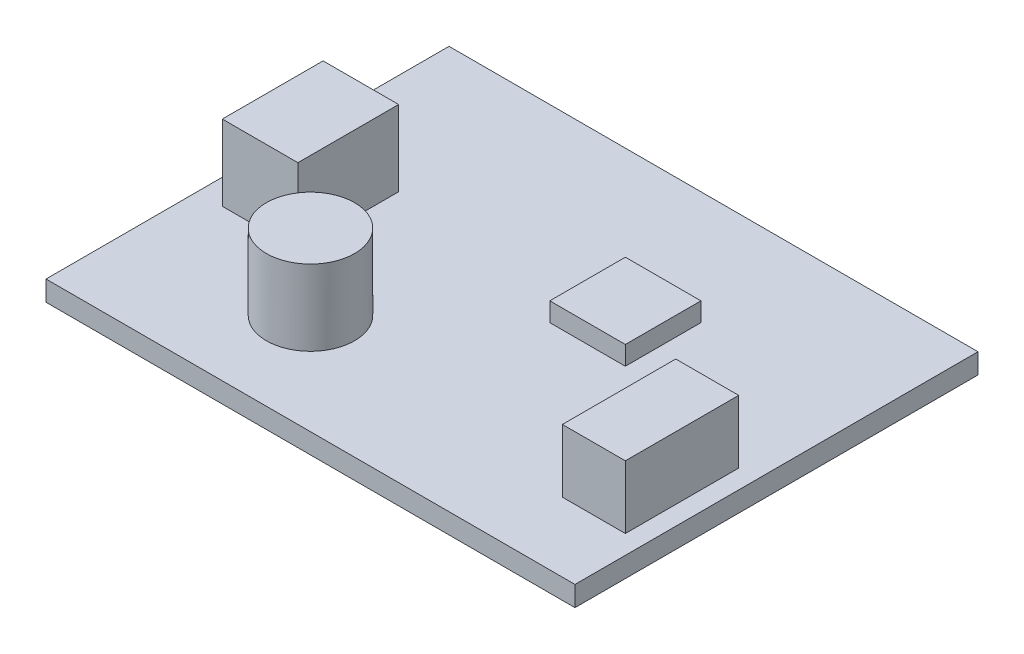
ISO-10303-21;
HEADER;
FILE_DESCRIPTION(('STEP AP214'),'2;1');
FILE_NAME('part.step','',(''),(''),'','','');
FILE_SCHEMA(('AUTOMOTIVE_DESIGN { 1 0 10303 214 1 1 1 1 }'));
ENDSEC;
DATA;
#1=APPLICATION_CONTEXT('core data for automotive mechanical design processes');
#2=APPLICATION_PROTOCOL_DEFINITION('international standard','automotive_design',2000,#1);
#3=PRODUCT_CONTEXT('',#1,'mechanical');
#4=PRODUCT('Part','Part','',(#3));
#5=PRODUCT_RELATED_PRODUCT_CATEGORY('part','',(#4));
#6=PRODUCT_DEFINITION_FORMATION('','',#4);
#7=PRODUCT_DEFINITION_CONTEXT('part definition',#1,'design');
#8=PRODUCT_DEFINITION('design','',#6,#7);
#9=PRODUCT_DEFINITION_SHAPE('','',#8);
#10=(LENGTH_UNIT() NAMED_UNIT(*) SI_UNIT(.MILLI.,.METRE.));
#11=(NAMED_UNIT(*) PLANE_ANGLE_UNIT() SI_UNIT($,.RADIAN.));
#12=(NAMED_UNIT(*) SI_UNIT($,.STERADIAN.) SOLID_ANGLE_UNIT());
#13=UNCERTAINTY_MEASURE_WITH_UNIT(LENGTH_MEASURE(1.E-05),#10,'distance_accuracy_value','');
#14=(GEOMETRIC_REPRESENTATION_CONTEXT(3) GLOBAL_UNCERTAINTY_ASSIGNED_CONTEXT((#13)) GLOBAL_UNIT_ASSIGNED_CONTEXT((#10,
#11,#12)) REPRESENTATION_CONTEXT('',''));
#15=CARTESIAN_POINT('',(0.,0.,0.));
#16=DIRECTION('',(0.,0.,1.));
#17=DIRECTION('',(1.,0.,0.));
#18=AXIS2_PLACEMENT_3D('',#15,#16,#17);
#19=CARTESIAN_POINT('',(0.,1.6,0.));
#20=DIRECTION('',(0.,-1.,0.));
#21=DIRECTION('',(0.,0.,-1.));
#22=AXIS2_PLACEMENT_3D('',#19,#20,#21);
#23=PLANE('',#22);
#24=CARTESIAN_POINT('',(-8.,1.6,8.));
#25=DIRECTION('',(0.,-1.,0.));
#26=DIRECTION('',(0.,0.,-1.));
#27=AXIS2_PLACEMENT_3D('',#24,#25,#26);
#28=CIRCLE('',#27,3.5);
#29=CARTESIAN_POINT('',(-8.,1.6,4.5));
#30=VERTEX_POINT('',#29);
#31=EDGE_CURVE('E11',#30,#30,#28,.F.);
#32=ORIENTED_EDGE('',*,*,#31,.F.);
#33=EDGE_LOOP('',(#32));
#34=FACE_BOUND('',#33,.T.);
#35=DIRECTION('',(0.,0.,-1.));
#36=VECTOR('',#35,1.);
#37=CARTESIAN_POINT('',(19.5,1.6,10.5));
#38=LINE('',#37,#36);
#39=CARTESIAN_POINT('',(19.5,1.6,10.5));
#40=VERTEX_POINT('',#39);
#41=CARTESIAN_POINT('',(19.5,1.6,1.5));
#42=VERTEX_POINT('',#41);
#43=EDGE_CURVE('E189',#40,#42,#38,.T.);
#44=ORIENTED_EDGE('',*,*,#43,.F.);
#45=DIRECTION('',(1.,0.,0.));
#46=VECTOR('',#45,1.);
#47=CARTESIAN_POINT('',(14.5,1.6,10.5));
#48=LINE('',#47,#46);
#49=CARTESIAN_POINT('',(14.5,1.6,10.5));
#50=VERTEX_POINT('',#49);
#51=EDGE_CURVE('E201',#50,#40,#48,.T.);
#52=ORIENTED_EDGE('',*,*,#51,.F.);
#53=DIRECTION('',(0.,0.,1.));
#54=VECTOR('',#53,1.);
#55=CARTESIAN_POINT('',(14.5,1.6,10.5));
#56=LINE('',#55,#54);
#57=CARTESIAN_POINT('',(14.5,1.6,1.5));
#58=VERTEX_POINT('',#57);
#59=EDGE_CURVE('E216',#58,#50,#56,.T.);
#60=ORIENTED_EDGE('',*,*,#59,.F.);
#61=DIRECTION('',(-1.,0.,0.));
#62=VECTOR('',#61,1.);
#63=CARTESIAN_POINT('',(14.5,1.6,1.5));
#64=LINE('',#63,#62);
#65=EDGE_CURVE('E194',#42,#58,#64,.T.);
#66=ORIENTED_EDGE('',*,*,#65,.F.);
#67=EDGE_LOOP('',(#44,#52,#60,#66));
#68=FACE_BOUND('',#67,.T.);
#69=DIRECTION('',(0.,0.,-1.));
#70=VECTOR('',#69,1.);
#71=CARTESIAN_POINT('',(21.,1.6,16.));
#72=LINE('',#71,#70);
#73=CARTESIAN_POINT('',(21.,1.6,16.));
#74=VERTEX_POINT('',#73);
#75=CARTESIAN_POINT('',(21.,1.6,-16.));
#76=VERTEX_POINT('',#75);
#77=EDGE_CURVE('E285',#74,#76,#72,.T.);
#78=ORIENTED_EDGE('',*,*,#77,.T.);
#79=DIRECTION('',(-1.,0.,0.));
#80=VECTOR('',#79,1.);
#81=CARTESIAN_POINT('',(-21.,1.6,-16.));
#82=LINE('',#81,#80);
#83=CARTESIAN_POINT('',(-21.,1.6,-16.));
#84=VERTEX_POINT('',#83);
#85=EDGE_CURVE('E290',#76,#84,#82,.T.);
#86=ORIENTED_EDGE('',*,*,#85,.T.);
#87=DIRECTION('',(0.,0.,1.));
#88=VECTOR('',#87,1.);
#89=CARTESIAN_POINT('',(-21.,1.6,16.));
#90=LINE('',#89,#88);
#91=CARTESIAN_POINT('',(-21.,1.6,16.));
#92=VERTEX_POINT('',#91);
#93=EDGE_CURVE('E295',#84,#92,#90,.T.);
#94=ORIENTED_EDGE('',*,*,#93,.T.);
#95=DIRECTION('',(1.,0.,0.));
#96=VECTOR('',#95,1.);
#97=CARTESIAN_POINT('',(-21.,1.6,16.));
#98=LINE('',#97,#96);
#99=EDGE_CURVE('E293',#92,#74,#98,.T.);
#100=ORIENTED_EDGE('',*,*,#99,.T.);
#101=EDGE_LOOP('',(#78,#86,#94,#100));
#102=FACE_BOUND('',#101,.T.);
#103=DIRECTION('',(0.,0.,-1.));
#104=VECTOR('',#103,1.);
#105=CARTESIAN_POINT('',(8.,1.6,-1.));
#106=LINE('',#105,#104);
#107=CARTESIAN_POINT('',(8.,1.6,-1.));
#108=VERTEX_POINT('',#107);
#109=CARTESIAN_POINT('',(8.,1.6,-7.));
#110=VERTEX_POINT('',#109);
#111=EDGE_CURVE('E236',#108,#110,#106,.T.);
#112=ORIENTED_EDGE('',*,*,#111,.F.);
#113=DIRECTION('',(1.,0.,0.));
#114=VECTOR('',#113,1.);
#115=CARTESIAN_POINT('',(2.,1.6,-1.));
#116=LINE('',#115,#114);
#117=CARTESIAN_POINT('',(2.,1.6,-1.));
#118=VERTEX_POINT('',#117);
#119=EDGE_CURVE('E245',#118,#108,#116,.T.);
#120=ORIENTED_EDGE('',*,*,#119,.F.);
#121=DIRECTION('',(0.,0.,1.));
#122=VECTOR('',#121,1.);
#123=CARTESIAN_POINT('',(2.,1.6,-1.));
#124=LINE('',#123,#122);
#125=CARTESIAN_POINT('',(2.,1.6,-7.));
#126=VERTEX_POINT('',#125);
#127=EDGE_CURVE('E261',#126,#118,#124,.T.);
#128=ORIENTED_EDGE('',*,*,#127,.F.);
#129=DIRECTION('',(-1.,0.,0.));
#130=VECTOR('',#129,1.);
#131=CARTESIAN_POINT('',(2.,1.6,-7.));
#132=LINE('',#131,#130);
#133=EDGE_CURVE('E260',#110,#126,#132,.T.);
#134=ORIENTED_EDGE('',*,*,#133,.F.);
#135=EDGE_LOOP('',(#112,#120,#128,#134));
#136=FACE_BOUND('',#135,.T.);
#137=DIRECTION('',(0.,0.,-1.));
#138=VECTOR('',#137,1.);
#139=CARTESIAN_POINT('',(-13.,1.6,4.));
#140=LINE('',#139,#138);
#141=CARTESIAN_POINT('',(-13.,1.6,4.));
#142=VERTEX_POINT('',#141);
#143=CARTESIAN_POINT('',(-13.,1.6,-4.));
#144=VERTEX_POINT('',#143);
#145=EDGE_CURVE('E183',#142,#144,#140,.T.);
#146=ORIENTED_EDGE('',*,*,#145,.F.);
#147=DIRECTION('',(1.,0.,0.));
#148=VECTOR('',#147,1.);
#149=CARTESIAN_POINT('',(-19.,1.6,4.));
#150=LINE('',#149,#148);
#151=CARTESIAN_POINT('',(-19.,1.6,4.));
#152=VERTEX_POINT('',#151);
#153=EDGE_CURVE('E185',#152,#142,#150,.T.);
#154=ORIENTED_EDGE('',*,*,#153,.F.);
#155=DIRECTION('',(0.,0.,1.));
#156=VECTOR('',#155,1.);
#157=CARTESIAN_POINT('',(-19.,1.6,4.));
#158=LINE('',#157,#156);
#159=CARTESIAN_POINT('',(-19.,1.6,-4.));
#160=VERTEX_POINT('',#159);
#161=EDGE_CURVE('E68',#160,#152,#158,.T.);
#162=ORIENTED_EDGE('',*,*,#161,.F.);
#163=DIRECTION('',(-1.,0.,0.));
#164=VECTOR('',#163,1.);
#165=CARTESIAN_POINT('',(-19.,1.6,-4.));
#166=LINE('',#165,#164);
#167=EDGE_CURVE('E61',#144,#160,#166,.T.);
#168=ORIENTED_EDGE('',*,*,#167,.F.);
#169=EDGE_LOOP('',(#146,#154,#162,#168));
#170=FACE_BOUND('',#169,.T.);
#171=ADVANCED_FACE('F47',(#34,#68,#102,#136,#170),#23,.F.);
#172=CARTESIAN_POINT('',(21.,1.6,16.));
#173=DIRECTION('',(-1.,0.,0.));
#174=DIRECTION('',(0.,0.,1.));
#175=AXIS2_PLACEMENT_3D('',#172,#173,#174);
#176=PLANE('',#175);
#177=DIRECTION('',(0.,0.,-1.));
#178=VECTOR('',#177,1.);
#179=CARTESIAN_POINT('',(21.,0.,16.));
#180=LINE('',#179,#178);
#181=CARTESIAN_POINT('',(21.,0.,16.));
#182=VERTEX_POINT('',#181);
#183=CARTESIAN_POINT('',(21.,0.,-16.));
#184=VERTEX_POINT('',#183);
#185=EDGE_CURVE('E282',#182,#184,#180,.T.);
#186=ORIENTED_EDGE('',*,*,#185,.T.);
#187=DIRECTION('',(0.,-1.,0.));
#188=VECTOR('',#187,1.);
#189=CARTESIAN_POINT('',(21.,1.6,-16.));
#190=LINE('',#189,#188);
#191=EDGE_CURVE('E59',#76,#184,#190,.T.);
#192=ORIENTED_EDGE('',*,*,#191,.F.);
#193=ORIENTED_EDGE('',*,*,#77,.F.);
#194=DIRECTION('',(0.,-1.,0.));
#195=VECTOR('',#194,1.);
#196=CARTESIAN_POINT('',(21.,1.6,16.));
#197=LINE('',#196,#195);
#198=EDGE_CURVE('E297',#74,#182,#197,.T.);
#199=ORIENTED_EDGE('',*,*,#198,.T.);
#200=EDGE_LOOP('',(#186,#192,#193,#199));
#201=FACE_BOUND('',#200,.T.);
#202=ADVANCED_FACE('F51',(#201),#176,.F.);
#203=CARTESIAN_POINT('',(-21.,1.6,-16.));
#204=DIRECTION('',(0.,0.,1.));
#205=DIRECTION('',(1.,0.,0.));
#206=AXIS2_PLACEMENT_3D('',#203,#204,#205);
#207=PLANE('',#206);
#208=DIRECTION('',(-1.,0.,0.));
#209=VECTOR('',#208,1.);
#210=CARTESIAN_POINT('',(-21.,0.,-16.));
#211=LINE('',#210,#209);
#212=CARTESIAN_POINT('',(-21.,0.,-16.));
#213=VERTEX_POINT('',#212);
#214=EDGE_CURVE('E304',#184,#213,#211,.T.);
#215=ORIENTED_EDGE('',*,*,#214,.T.);
#216=DIRECTION('',(0.,-1.,0.));
#217=VECTOR('',#216,1.);
#218=CARTESIAN_POINT('',(-21.,1.6,-16.));
#219=LINE('',#218,#217);
#220=EDGE_CURVE('E320',#84,#213,#219,.T.);
#221=ORIENTED_EDGE('',*,*,#220,.F.);
#222=ORIENTED_EDGE('',*,*,#85,.F.);
#223=ORIENTED_EDGE('',*,*,#191,.T.);
#224=EDGE_LOOP('',(#215,#221,#222,#223));
#225=FACE_BOUND('',#224,.T.);
#226=ADVANCED_FACE('F322',(#225),#207,.F.);
#227=CARTESIAN_POINT('',(-21.,1.6,16.));
#228=DIRECTION('',(1.,0.,0.));
#229=DIRECTION('',(0.,0.,-1.));
#230=AXIS2_PLACEMENT_3D('',#227,#228,#229);
#231=PLANE('',#230);
#232=DIRECTION('',(0.,0.,1.));
#233=VECTOR('',#232,1.);
#234=CARTESIAN_POINT('',(-21.,0.,16.));
#235=LINE('',#234,#233);
#236=CARTESIAN_POINT('',(-21.,0.,16.));
#237=VERTEX_POINT('',#236);
#238=EDGE_CURVE('E303',#213,#237,#235,.T.);
#239=ORIENTED_EDGE('',*,*,#238,.T.);
#240=DIRECTION('',(0.,-1.,0.));
#241=VECTOR('',#240,1.);
#242=CARTESIAN_POINT('',(-21.,1.6,16.));
#243=LINE('',#242,#241);
#244=EDGE_CURVE('E311',#92,#237,#243,.T.);
#245=ORIENTED_EDGE('',*,*,#244,.F.);
#246=ORIENTED_EDGE('',*,*,#93,.F.);
#247=ORIENTED_EDGE('',*,*,#220,.T.);
#248=EDGE_LOOP('',(#239,#245,#246,#247));
#249=FACE_BOUND('',#248,.T.);
#250=ADVANCED_FACE('F338',(#249),#231,.F.);
#251=CARTESIAN_POINT('',(-21.,1.6,16.));
#252=DIRECTION('',(0.,0.,-1.));
#253=DIRECTION('',(-1.,0.,0.));
#254=AXIS2_PLACEMENT_3D('',#251,#252,#253);
#255=PLANE('',#254);
#256=DIRECTION('',(1.,0.,0.));
#257=VECTOR('',#256,1.);
#258=CARTESIAN_POINT('',(-21.,0.,16.));
#259=LINE('',#258,#257);
#260=EDGE_CURVE('E286',#237,#182,#259,.T.);
#261=ORIENTED_EDGE('',*,*,#260,.T.);
#262=ORIENTED_EDGE('',*,*,#198,.F.);
#263=ORIENTED_EDGE('',*,*,#99,.F.);
#264=ORIENTED_EDGE('',*,*,#244,.T.);
#265=EDGE_LOOP('',(#261,#262,#263,#264));
#266=FACE_BOUND('',#265,.T.);
#267=ADVANCED_FACE('F336',(#266),#255,.F.);
#268=CARTESIAN_POINT('',(0.,0.,0.));
#269=DIRECTION('',(0.,-1.,0.));
#270=DIRECTION('',(0.,0.,-1.));
#271=AXIS2_PLACEMENT_3D('',#268,#269,#270);
#272=PLANE('',#271);
#273=ORIENTED_EDGE('',*,*,#185,.F.);
#274=ORIENTED_EDGE('',*,*,#260,.F.);
#275=ORIENTED_EDGE('',*,*,#238,.F.);
#276=ORIENTED_EDGE('',*,*,#214,.F.);
#277=EDGE_LOOP('',(#273,#274,#275,#276));
#278=FACE_BOUND('',#277,.T.);
#279=ADVANCED_FACE('F335',(#278),#272,.T.);
#280=CARTESIAN_POINT('',(8.,3.1,-1.));
#281=DIRECTION('',(-1.,0.,0.));
#282=DIRECTION('',(0.,0.,1.));
#283=AXIS2_PLACEMENT_3D('',#280,#281,#282);
#284=PLANE('',#283);
#285=ORIENTED_EDGE('',*,*,#111,.T.);
#286=DIRECTION('',(0.,-1.,0.));
#287=VECTOR('',#286,1.);
#288=CARTESIAN_POINT('',(8.,3.1,-7.));
#289=LINE('',#288,#287);
#290=CARTESIAN_POINT('',(8.,3.1,-7.));
#291=VERTEX_POINT('',#290);
#292=EDGE_CURVE('E276',#291,#110,#289,.T.);
#293=ORIENTED_EDGE('',*,*,#292,.F.);
#294=DIRECTION('',(0.,0.,-1.));
#295=VECTOR('',#294,1.);
#296=CARTESIAN_POINT('',(8.,3.1,-1.));
#297=LINE('',#296,#295);
#298=CARTESIAN_POINT('',(8.,3.1,-1.));
#299=VERTEX_POINT('',#298);
#300=EDGE_CURVE('E239',#299,#291,#297,.T.);
#301=ORIENTED_EDGE('',*,*,#300,.F.);
#302=DIRECTION('',(0.,-1.,0.));
#303=VECTOR('',#302,1.);
#304=CARTESIAN_POINT('',(8.,3.1,-1.));
#305=LINE('',#304,#303);
#306=EDGE_CURVE('E251',#299,#108,#305,.T.);
#307=ORIENTED_EDGE('',*,*,#306,.T.);
#308=EDGE_LOOP('',(#285,#293,#301,#307));
#309=FACE_BOUND('',#308,.T.);
#310=ADVANCED_FACE('F421',(#309),#284,.F.);
#311=CARTESIAN_POINT('',(2.,3.1,-7.));
#312=DIRECTION('',(0.,0.,1.));
#313=DIRECTION('',(1.,0.,0.));
#314=AXIS2_PLACEMENT_3D('',#311,#312,#313);
#315=PLANE('',#314);
#316=ORIENTED_EDGE('',*,*,#133,.T.);
#317=DIRECTION('',(0.,-1.,0.));
#318=VECTOR('',#317,1.);
#319=CARTESIAN_POINT('',(2.,3.1,-7.));
#320=LINE('',#319,#318);
#321=CARTESIAN_POINT('',(2.,3.1,-7.));
#322=VERTEX_POINT('',#321);
#323=EDGE_CURVE('E274',#322,#126,#320,.T.);
#324=ORIENTED_EDGE('',*,*,#323,.F.);
#325=DIRECTION('',(-1.,0.,0.));
#326=VECTOR('',#325,1.);
#327=CARTESIAN_POINT('',(2.,3.1,-7.));
#328=LINE('',#327,#326);
#329=EDGE_CURVE('E242',#291,#322,#328,.T.);
#330=ORIENTED_EDGE('',*,*,#329,.F.);
#331=ORIENTED_EDGE('',*,*,#292,.T.);
#332=EDGE_LOOP('',(#316,#324,#330,#331));
#333=FACE_BOUND('',#332,.T.);
#334=ADVANCED_FACE('F420',(#333),#315,.F.);
#335=CARTESIAN_POINT('',(2.,3.1,-1.));
#336=DIRECTION('',(1.,0.,0.));
#337=DIRECTION('',(0.,0.,-1.));
#338=AXIS2_PLACEMENT_3D('',#335,#336,#337);
#339=PLANE('',#338);
#340=ORIENTED_EDGE('',*,*,#127,.T.);
#341=DIRECTION('',(0.,-1.,0.));
#342=VECTOR('',#341,1.);
#343=CARTESIAN_POINT('',(2.,3.1,-1.));
#344=LINE('',#343,#342);
#345=CARTESIAN_POINT('',(2.,3.1,-1.));
#346=VERTEX_POINT('',#345);
#347=EDGE_CURVE('E271',#346,#118,#344,.T.);
#348=ORIENTED_EDGE('',*,*,#347,.F.);
#349=DIRECTION('',(0.,0.,1.));
#350=VECTOR('',#349,1.);
#351=CARTESIAN_POINT('',(2.,3.1,-1.));
#352=LINE('',#351,#350);
#353=EDGE_CURVE('E249',#322,#346,#352,.T.);
#354=ORIENTED_EDGE('',*,*,#353,.F.);
#355=ORIENTED_EDGE('',*,*,#323,.T.);
#356=EDGE_LOOP('',(#340,#348,#354,#355));
#357=FACE_BOUND('',#356,.T.);
#358=ADVANCED_FACE('F413',(#357),#339,.F.);
#359=CARTESIAN_POINT('',(2.,3.1,-1.));
#360=DIRECTION('',(0.,0.,-1.));
#361=DIRECTION('',(-1.,0.,0.));
#362=AXIS2_PLACEMENT_3D('',#359,#360,#361);
#363=PLANE('',#362);
#364=ORIENTED_EDGE('',*,*,#119,.T.);
#365=ORIENTED_EDGE('',*,*,#306,.F.);
#366=DIRECTION('',(1.,0.,0.));
#367=VECTOR('',#366,1.);
#368=CARTESIAN_POINT('',(2.,3.1,-1.));
#369=LINE('',#368,#367);
#370=EDGE_CURVE('E248',#346,#299,#369,.T.);
#371=ORIENTED_EDGE('',*,*,#370,.F.);
#372=ORIENTED_EDGE('',*,*,#347,.T.);
#373=EDGE_LOOP('',(#364,#365,#371,#372));
#374=FACE_BOUND('',#373,.T.);
#375=ADVANCED_FACE('F412',(#374),#363,.F.);
#376=CARTESIAN_POINT('',(0.,3.1,0.));
#377=DIRECTION('',(0.,-1.,0.));
#378=DIRECTION('',(0.,0.,-1.));
#379=AXIS2_PLACEMENT_3D('',#376,#377,#378);
#380=PLANE('',#379);
#381=ORIENTED_EDGE('',*,*,#300,.T.);
#382=ORIENTED_EDGE('',*,*,#329,.T.);
#383=ORIENTED_EDGE('',*,*,#353,.T.);
#384=ORIENTED_EDGE('',*,*,#370,.T.);
#385=EDGE_LOOP('',(#381,#382,#383,#384));
#386=FACE_BOUND('',#385,.T.);
#387=ADVANCED_FACE('F403',(#386),#380,.F.);
#388=CARTESIAN_POINT('',(19.5,6.6,10.5));
#389=DIRECTION('',(-1.,0.,0.));
#390=DIRECTION('',(0.,0.,1.));
#391=AXIS2_PLACEMENT_3D('',#388,#389,#390);
#392=PLANE('',#391);
#393=ORIENTED_EDGE('',*,*,#43,.T.);
#394=DIRECTION('',(0.,-1.,0.));
#395=VECTOR('',#394,1.);
#396=CARTESIAN_POINT('',(19.5,6.6,1.5));
#397=LINE('',#396,#395);
#398=CARTESIAN_POINT('',(19.5,6.6,1.5));
#399=VERTEX_POINT('',#398);
#400=EDGE_CURVE('E231',#399,#42,#397,.T.);
#401=ORIENTED_EDGE('',*,*,#400,.F.);
#402=DIRECTION('',(0.,0.,-1.));
#403=VECTOR('',#402,1.);
#404=CARTESIAN_POINT('',(19.5,6.6,10.5));
#405=LINE('',#404,#403);
#406=CARTESIAN_POINT('',(19.5,6.6,10.5));
#407=VERTEX_POINT('',#406);
#408=EDGE_CURVE('E196',#407,#399,#405,.T.);
#409=ORIENTED_EDGE('',*,*,#408,.F.);
#410=DIRECTION('',(0.,-1.,0.));
#411=VECTOR('',#410,1.);
#412=CARTESIAN_POINT('',(19.5,6.6,10.5));
#413=LINE('',#412,#411);
#414=EDGE_CURVE('E211',#407,#40,#413,.T.);
#415=ORIENTED_EDGE('',*,*,#414,.T.);
#416=EDGE_LOOP('',(#393,#401,#409,#415));
#417=FACE_BOUND('',#416,.T.);
#418=ADVANCED_FACE('F386',(#417),#392,.F.);
#419=CARTESIAN_POINT('',(14.5,6.6,1.5));
#420=DIRECTION('',(0.,0.,1.));
#421=DIRECTION('',(1.,0.,0.));
#422=AXIS2_PLACEMENT_3D('',#419,#420,#421);
#423=PLANE('',#422);
#424=ORIENTED_EDGE('',*,*,#65,.T.);
#425=DIRECTION('',(0.,-1.,0.));
#426=VECTOR('',#425,1.);
#427=CARTESIAN_POINT('',(14.5,6.6,1.5));
#428=LINE('',#427,#426);
#429=CARTESIAN_POINT('',(14.5,6.6,1.5));
#430=VERTEX_POINT('',#429);
#431=EDGE_CURVE('E226',#430,#58,#428,.T.);
#432=ORIENTED_EDGE('',*,*,#431,.F.);
#433=DIRECTION('',(-1.,0.,0.));
#434=VECTOR('',#433,1.);
#435=CARTESIAN_POINT('',(14.5,6.6,1.5));
#436=LINE('',#435,#434);
#437=EDGE_CURVE('E205',#399,#430,#436,.T.);
#438=ORIENTED_EDGE('',*,*,#437,.F.);
#439=ORIENTED_EDGE('',*,*,#400,.T.);
#440=EDGE_LOOP('',(#424,#432,#438,#439));
#441=FACE_BOUND('',#440,.T.);
#442=ADVANCED_FACE('F399',(#441),#423,.F.);
#443=CARTESIAN_POINT('',(14.5,6.6,10.5));
#444=DIRECTION('',(1.,0.,0.));
#445=DIRECTION('',(0.,0.,-1.));
#446=AXIS2_PLACEMENT_3D('',#443,#444,#445);
#447=PLANE('',#446);
#448=ORIENTED_EDGE('',*,*,#59,.T.);
#449=DIRECTION('',(0.,-1.,0.));
#450=VECTOR('',#449,1.);
#451=CARTESIAN_POINT('',(14.5,6.6,10.5));
#452=LINE('',#451,#450);
#453=CARTESIAN_POINT('',(14.5,6.6,10.5));
#454=VERTEX_POINT('',#453);
#455=EDGE_CURVE('E228',#454,#50,#452,.T.);
#456=ORIENTED_EDGE('',*,*,#455,.F.);
#457=DIRECTION('',(0.,0.,1.));
#458=VECTOR('',#457,1.);
#459=CARTESIAN_POINT('',(14.5,6.6,10.5));
#460=LINE('',#459,#458);
#461=EDGE_CURVE('E206',#430,#454,#460,.T.);
#462=ORIENTED_EDGE('',*,*,#461,.F.);
#463=ORIENTED_EDGE('',*,*,#431,.T.);
#464=EDGE_LOOP('',(#448,#456,#462,#463));
#465=FACE_BOUND('',#464,.T.);
#466=ADVANCED_FACE('F391',(#465),#447,.F.);
#467=CARTESIAN_POINT('',(14.5,6.6,10.5));
#468=DIRECTION('',(0.,0.,-1.));
#469=DIRECTION('',(-1.,0.,0.));
#470=AXIS2_PLACEMENT_3D('',#467,#468,#469);
#471=PLANE('',#470);
#472=ORIENTED_EDGE('',*,*,#51,.T.);
#473=ORIENTED_EDGE('',*,*,#414,.F.);
#474=DIRECTION('',(1.,0.,0.));
#475=VECTOR('',#474,1.);
#476=CARTESIAN_POINT('',(14.5,6.6,10.5));
#477=LINE('',#476,#475);
#478=EDGE_CURVE('E207',#454,#407,#477,.T.);
#479=ORIENTED_EDGE('',*,*,#478,.F.);
#480=ORIENTED_EDGE('',*,*,#455,.T.);
#481=EDGE_LOOP('',(#472,#473,#479,#480));
#482=FACE_BOUND('',#481,.T.);
#483=ADVANCED_FACE('F384',(#482),#471,.F.);
#484=CARTESIAN_POINT('',(0.,6.6,0.));
#485=DIRECTION('',(0.,-1.,0.));
#486=DIRECTION('',(0.,0.,-1.));
#487=AXIS2_PLACEMENT_3D('',#484,#485,#486);
#488=PLANE('',#487);
#489=ORIENTED_EDGE('',*,*,#408,.T.);
#490=ORIENTED_EDGE('',*,*,#437,.T.);
#491=ORIENTED_EDGE('',*,*,#461,.T.);
#492=ORIENTED_EDGE('',*,*,#478,.T.);
#493=EDGE_LOOP('',(#489,#490,#491,#492));
#494=FACE_BOUND('',#493,.T.);
#495=ADVANCED_FACE('F393',(#494),#488,.F.);
#496=CARTESIAN_POINT('',(-13.,7.6,4.));
#497=DIRECTION('',(-1.,0.,0.));
#498=DIRECTION('',(0.,0.,1.));
#499=AXIS2_PLACEMENT_3D('',#496,#497,#498);
#500=PLANE('',#499);
#501=ORIENTED_EDGE('',*,*,#145,.T.);
#502=DIRECTION('',(0.,-1.,0.));
#503=VECTOR('',#502,1.);
#504=CARTESIAN_POINT('',(-13.,7.6,-4.));
#505=LINE('',#504,#503);
#506=CARTESIAN_POINT('',(-13.,7.6,-4.));
#507=VERTEX_POINT('',#506);
#508=EDGE_CURVE('E163',#507,#144,#505,.T.);
#509=ORIENTED_EDGE('',*,*,#508,.F.);
#510=DIRECTION('',(0.,0.,-1.));
#511=VECTOR('',#510,1.);
#512=CARTESIAN_POINT('',(-13.,7.6,4.));
#513=LINE('',#512,#511);
#514=CARTESIAN_POINT('',(-13.,7.6,4.));
#515=VERTEX_POINT('',#514);
#516=EDGE_CURVE('E174',#515,#507,#513,.T.);
#517=ORIENTED_EDGE('',*,*,#516,.F.);
#518=DIRECTION('',(0.,-1.,0.));
#519=VECTOR('',#518,1.);
#520=CARTESIAN_POINT('',(-13.,7.6,4.));
#521=LINE('',#520,#519);
#522=EDGE_CURVE('E352',#515,#142,#521,.T.);
#523=ORIENTED_EDGE('',*,*,#522,.T.);
#524=EDGE_LOOP('',(#501,#509,#517,#523));
#525=FACE_BOUND('',#524,.T.);
#526=ADVANCED_FACE('F184',(#525),#500,.F.);
#527=CARTESIAN_POINT('',(-19.,7.6,-4.));
#528=DIRECTION('',(0.,0.,1.));
#529=DIRECTION('',(1.,0.,0.));
#530=AXIS2_PLACEMENT_3D('',#527,#528,#529);
#531=PLANE('',#530);
#532=ORIENTED_EDGE('',*,*,#167,.T.);
#533=DIRECTION('',(0.,-1.,0.));
#534=VECTOR('',#533,1.);
#535=CARTESIAN_POINT('',(-19.,7.6,-4.));
#536=LINE('',#535,#534);
#537=CARTESIAN_POINT('',(-19.,7.6,-4.));
#538=VERTEX_POINT('',#537);
#539=EDGE_CURVE('E170',#538,#160,#536,.T.);
#540=ORIENTED_EDGE('',*,*,#539,.F.);
#541=DIRECTION('',(-1.,0.,0.));
#542=VECTOR('',#541,1.);
#543=CARTESIAN_POINT('',(-19.,7.6,-4.));
#544=LINE('',#543,#542);
#545=EDGE_CURVE('E159',#507,#538,#544,.T.);
#546=ORIENTED_EDGE('',*,*,#545,.F.);
#547=ORIENTED_EDGE('',*,*,#508,.T.);
#548=EDGE_LOOP('',(#532,#540,#546,#547));
#549=FACE_BOUND('',#548,.T.);
#550=ADVANCED_FACE('F165',(#549),#531,.F.);
#551=CARTESIAN_POINT('',(-19.,7.6,4.));
#552=DIRECTION('',(1.,0.,0.));
#553=DIRECTION('',(0.,0.,-1.));
#554=AXIS2_PLACEMENT_3D('',#551,#552,#553);
#555=PLANE('',#554);
#556=ORIENTED_EDGE('',*,*,#161,.T.);
#557=DIRECTION('',(0.,-1.,0.));
#558=VECTOR('',#557,1.);
#559=CARTESIAN_POINT('',(-19.,7.6,4.));
#560=LINE('',#559,#558);
#561=CARTESIAN_POINT('',(-19.,7.6,4.));
#562=VERTEX_POINT('',#561);
#563=EDGE_CURVE('E191',#562,#152,#560,.T.);
#564=ORIENTED_EDGE('',*,*,#563,.F.);
#565=DIRECTION('',(0.,0.,1.));
#566=VECTOR('',#565,1.);
#567=CARTESIAN_POINT('',(-19.,7.6,4.));
#568=LINE('',#567,#566);
#569=EDGE_CURVE('E173',#538,#562,#568,.T.);
#570=ORIENTED_EDGE('',*,*,#569,.F.);
#571=ORIENTED_EDGE('',*,*,#539,.T.);
#572=EDGE_LOOP('',(#556,#564,#570,#571));
#573=FACE_BOUND('',#572,.T.);
#574=ADVANCED_FACE('F569',(#573),#555,.F.);
#575=CARTESIAN_POINT('',(-19.,7.6,4.));
#576=DIRECTION('',(0.,0.,-1.));
#577=DIRECTION('',(-1.,0.,0.));
#578=AXIS2_PLACEMENT_3D('',#575,#576,#577);
#579=PLANE('',#578);
#580=ORIENTED_EDGE('',*,*,#153,.T.);
#581=ORIENTED_EDGE('',*,*,#522,.F.);
#582=DIRECTION('',(1.,0.,0.));
#583=VECTOR('',#582,1.);
#584=CARTESIAN_POINT('',(-19.,7.6,4.));
#585=LINE('',#584,#583);
#586=EDGE_CURVE('E179',#562,#515,#585,.T.);
#587=ORIENTED_EDGE('',*,*,#586,.F.);
#588=ORIENTED_EDGE('',*,*,#563,.T.);
#589=EDGE_LOOP('',(#580,#581,#587,#588));
#590=FACE_BOUND('',#589,.T.);
#591=ADVANCED_FACE('F354',(#590),#579,.F.);
#592=CARTESIAN_POINT('',(0.,7.6,0.));
#593=DIRECTION('',(0.,-1.,0.));
#594=DIRECTION('',(0.,0.,-1.));
#595=AXIS2_PLACEMENT_3D('',#592,#593,#594);
#596=PLANE('',#595);
#597=ORIENTED_EDGE('',*,*,#516,.T.);
#598=ORIENTED_EDGE('',*,*,#545,.T.);
#599=ORIENTED_EDGE('',*,*,#569,.T.);
#600=ORIENTED_EDGE('',*,*,#586,.T.);
#601=EDGE_LOOP('',(#597,#598,#599,#600));
#602=FACE_BOUND('',#601,.T.);
#603=ADVANCED_FACE('F171',(#602),#596,.F.);
#604=CARTESIAN_POINT('',(-8.,7.6,8.));
#605=DIRECTION('',(0.,-1.,0.));
#606=DIRECTION('',(0.,0.,-1.));
#607=AXIS2_PLACEMENT_3D('',#604,#605,#606);
#608=CYLINDRICAL_SURFACE('',#607,3.5);
#609=CARTESIAN_POINT('',(-8.,7.6,8.));
#610=DIRECTION('',(0.,1.,0.));
#611=DIRECTION('',(0.,0.,1.));
#612=AXIS2_PLACEMENT_3D('',#609,#610,#611);
#613=CIRCLE('',#612,3.5);
#614=CARTESIAN_POINT('',(-8.,7.6,11.5));
#615=VERTEX_POINT('',#614);
#616=EDGE_CURVE('E346',#615,#615,#613,.T.);
#617=ORIENTED_EDGE('',*,*,#616,.F.);
#618=EDGE_LOOP('',(#617));
#619=FACE_BOUND('',#618,.T.);
#620=ORIENTED_EDGE('',*,*,#31,.T.);
#621=EDGE_LOOP('',(#620));
#622=FACE_BOUND('',#621,.T.);
#623=ADVANCED_FACE('F374',(#619,#622),#608,.T.);
#624=CARTESIAN_POINT('',(-8.,7.6,8.));
#625=DIRECTION('',(0.,1.,0.));
#626=DIRECTION('',(0.,0.,1.));
#627=AXIS2_PLACEMENT_3D('',#624,#625,#626);
#628=PLANE('',#627);
#629=ORIENTED_EDGE('',*,*,#616,.T.);
#630=EDGE_LOOP('',(#629));
#631=FACE_BOUND('',#630,.T.);
#632=ADVANCED_FACE('F373',(#631),#628,.T.);
#633=CLOSED_SHELL('',(#171,#202,#226,#250,#267,#279,#310,#334,#358,#375,#387,#418,#442,#466,
#483,#495,#526,#550,#574,#591,#603,#623,#632));
#634=MANIFOLD_SOLID_BREP('B2',#633);
#635=ADVANCED_BREP_SHAPE_REPRESENTATION('',(#18,#634),#14);
#636=SHAPE_DEFINITION_REPRESENTATION(#9,#635);
ENDSEC;
END-ISO-10303-21;
